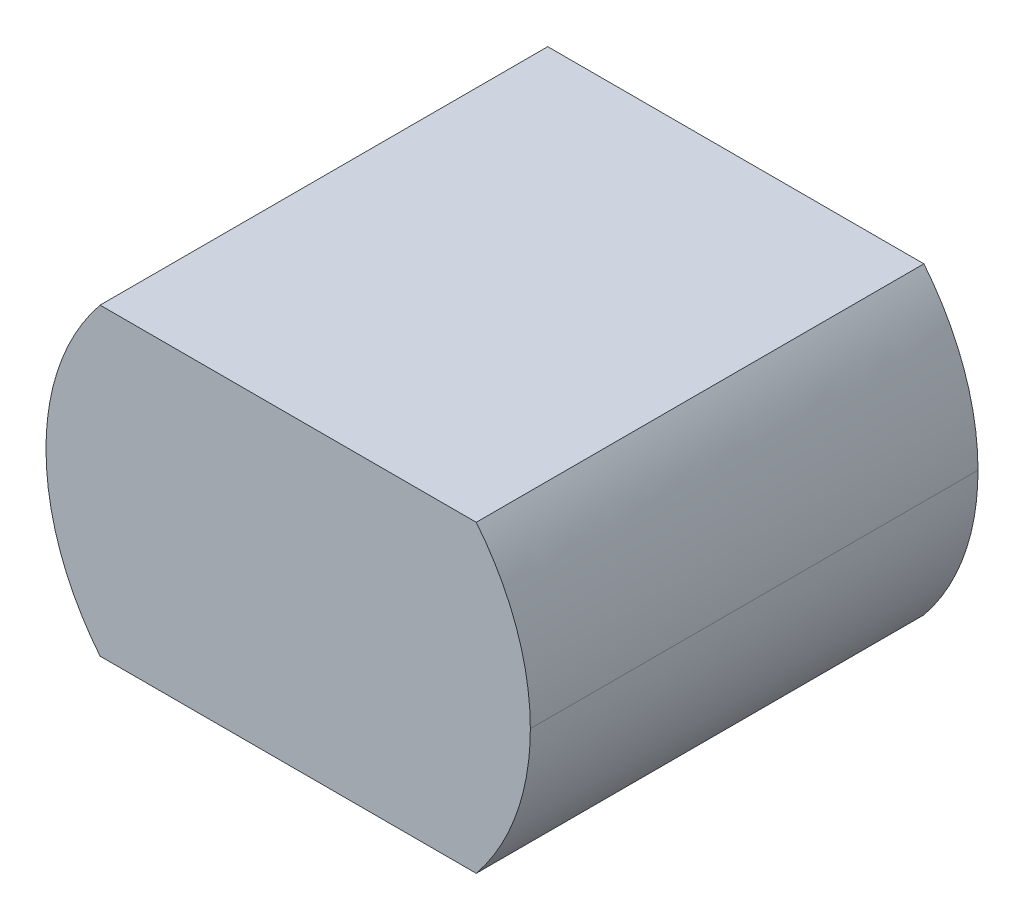
ISO-10303-21;
HEADER;
FILE_DESCRIPTION(('STEP AP214'),'2;1');
FILE_NAME('part.step','',(''),(''),'','','');
FILE_SCHEMA(('AUTOMOTIVE_DESIGN { 1 0 10303 214 1 1 1 1 }'));
ENDSEC;
DATA;
#1=APPLICATION_CONTEXT('core data for automotive mechanical design processes');
#2=APPLICATION_PROTOCOL_DEFINITION('international standard','automotive_design',2000,#1);
#3=PRODUCT_CONTEXT('',#1,'mechanical');
#4=PRODUCT('Part','Part','',(#3));
#5=PRODUCT_RELATED_PRODUCT_CATEGORY('part','',(#4));
#6=PRODUCT_DEFINITION_FORMATION('','',#4);
#7=PRODUCT_DEFINITION_CONTEXT('part definition',#1,'design');
#8=PRODUCT_DEFINITION('design','',#6,#7);
#9=PRODUCT_DEFINITION_SHAPE('','',#8);
#10=(LENGTH_UNIT() NAMED_UNIT(*) SI_UNIT(.MILLI.,.METRE.));
#11=(NAMED_UNIT(*) PLANE_ANGLE_UNIT() SI_UNIT($,.RADIAN.));
#12=(NAMED_UNIT(*) SI_UNIT($,.STERADIAN.) SOLID_ANGLE_UNIT());
#13=UNCERTAINTY_MEASURE_WITH_UNIT(LENGTH_MEASURE(1.E-05),#10,'distance_accuracy_value','');
#14=(GEOMETRIC_REPRESENTATION_CONTEXT(3) GLOBAL_UNCERTAINTY_ASSIGNED_CONTEXT((#13)) GLOBAL_UNIT_ASSIGNED_CONTEXT((#10,
#11,#12)) REPRESENTATION_CONTEXT('',''));
#15=CARTESIAN_POINT('',(0.,0.,0.));
#16=DIRECTION('',(0.,0.,1.));
#17=DIRECTION('',(1.,0.,0.));
#18=AXIS2_PLACEMENT_3D('',#15,#16,#17);
#19=CARTESIAN_POINT('',(102.326282,222.803668,6.35));
#20=CARTESIAN_POINT('',(102.803966,223.393521,6.35));
#21=CARTESIAN_POINT('',(103.093574,224.146283,6.35));
#22=CARTESIAN_POINT('',(103.093574,224.964432,6.35));
#23=B_SPLINE_CURVE_WITH_KNOTS('',3,(#19,#20,#21,#22),.UNSPECIFIED.,.F.,.F.,(4,4),(0.,1.),.UNSPECIFIED.);
#24=DIRECTION('',(0.,0.,-1.));
#25=VECTOR('',#24,1.);
#26=SURFACE_OF_LINEAR_EXTRUSION('',#23,#25);
#27=CARTESIAN_POINT('',(102.326282,222.803668,0.));
#28=CARTESIAN_POINT('',(102.803966,223.393521,0.));
#29=CARTESIAN_POINT('',(103.093574,224.146283,0.));
#30=CARTESIAN_POINT('',(103.093574,224.964432,0.));
#31=B_SPLINE_CURVE_WITH_KNOTS('',3,(#27,#28,#29,#30),.UNSPECIFIED.,.F.,.F.,(4,4),(0.,1.),.UNSPECIFIED.);
#32=CARTESIAN_POINT('',(102.326282,222.803668,0.));
#33=VERTEX_POINT('',#32);
#34=CARTESIAN_POINT('',(103.093574,224.964432,0.));
#35=VERTEX_POINT('',#34);
#36=EDGE_CURVE('E174',#33,#35,#31,.T.);
#37=ORIENTED_EDGE('',*,*,#36,.T.);
#38=DIRECTION('',(0.,0.,-1.));
#39=VECTOR('',#38,1.);
#40=CARTESIAN_POINT('',(103.093574,224.964432,6.35));
#41=LINE('',#40,#39);
#42=CARTESIAN_POINT('',(103.093574,224.964432,6.35));
#43=VERTEX_POINT('',#42);
#44=EDGE_CURVE('E11',#43,#35,#41,.T.);
#45=ORIENTED_EDGE('',*,*,#44,.F.);
#46=CARTESIAN_POINT('',(102.326282,222.803668,6.35));
#47=VERTEX_POINT('',#46);
#48=EDGE_CURVE('E146',#47,#43,#23,.T.);
#49=ORIENTED_EDGE('',*,*,#48,.F.);
#50=DIRECTION('',(0.,0.,-1.));
#51=VECTOR('',#50,1.);
#52=CARTESIAN_POINT('',(102.326282,222.803668,6.35));
#53=LINE('',#52,#51);
#54=EDGE_CURVE('E116',#47,#33,#53,.T.);
#55=ORIENTED_EDGE('',*,*,#54,.T.);
#56=EDGE_LOOP('',(#37,#45,#49,#55));
#57=FACE_BOUND('',#56,.T.);
#58=ADVANCED_FACE('F35',(#57),#26,.F.);
#59=CARTESIAN_POINT('',(103.093574,224.964432,6.35));
#60=CARTESIAN_POINT('',(103.093574,225.78258,6.35));
#61=CARTESIAN_POINT('',(102.803966,226.526523,6.35));
#62=CARTESIAN_POINT('',(102.326282,227.116376,6.35));
#63=B_SPLINE_CURVE_WITH_KNOTS('',3,(#59,#60,#61,#62),.UNSPECIFIED.,.F.,.F.,(4,4),(0.,1.),.UNSPECIFIED.);
#64=DIRECTION('',(0.,0.,-1.));
#65=VECTOR('',#64,1.);
#66=SURFACE_OF_LINEAR_EXTRUSION('',#63,#65);
#67=CARTESIAN_POINT('',(103.093574,224.964432,0.));
#68=CARTESIAN_POINT('',(103.093574,225.78258,0.));
#69=CARTESIAN_POINT('',(102.803966,226.526523,0.));
#70=CARTESIAN_POINT('',(102.326282,227.116376,0.));
#71=B_SPLINE_CURVE_WITH_KNOTS('',3,(#67,#68,#69,#70),.UNSPECIFIED.,.F.,.F.,(4,4),(0.,1.),.UNSPECIFIED.);
#72=CARTESIAN_POINT('',(102.326282,227.116376,0.));
#73=VERTEX_POINT('',#72);
#74=EDGE_CURVE('E172',#35,#73,#71,.T.);
#75=ORIENTED_EDGE('',*,*,#74,.T.);
#76=DIRECTION('',(0.,0.,-1.));
#77=VECTOR('',#76,1.);
#78=CARTESIAN_POINT('',(102.326282,227.116376,6.35));
#79=LINE('',#78,#77);
#80=CARTESIAN_POINT('',(102.326282,227.116376,6.35));
#81=VERTEX_POINT('',#80);
#82=EDGE_CURVE('E44',#81,#73,#79,.T.);
#83=ORIENTED_EDGE('',*,*,#82,.F.);
#84=EDGE_CURVE('E89',#43,#81,#63,.T.);
#85=ORIENTED_EDGE('',*,*,#84,.F.);
#86=ORIENTED_EDGE('',*,*,#44,.T.);
#87=EDGE_LOOP('',(#75,#83,#85,#86));
#88=FACE_BOUND('',#87,.T.);
#89=ADVANCED_FACE('F139',(#88),#66,.F.);
#90=CARTESIAN_POINT('',(0.,227.116376,6.35));
#91=DIRECTION('',(0.,-1.,0.));
#92=DIRECTION('',(0.,0.,-1.));
#93=AXIS2_PLACEMENT_3D('',#90,#91,#92);
#94=PLANE('',#93);
#95=DIRECTION('',(-1.,0.,0.));
#96=VECTOR('',#95,1.);
#97=CARTESIAN_POINT('',(0.,227.116376,0.));
#98=LINE('',#97,#96);
#99=CARTESIAN_POINT('',(96.990521,227.116376,0.));
#100=VERTEX_POINT('',#99);
#101=EDGE_CURVE('E168',#73,#100,#98,.T.);
#102=ORIENTED_EDGE('',*,*,#101,.T.);
#103=DIRECTION('',(0.,0.,-1.));
#104=VECTOR('',#103,1.);
#105=CARTESIAN_POINT('',(96.990521,227.116376,6.35));
#106=LINE('',#105,#104);
#107=CARTESIAN_POINT('',(96.990521,227.116376,6.35));
#108=VERTEX_POINT('',#107);
#109=EDGE_CURVE('E111',#108,#100,#106,.T.);
#110=ORIENTED_EDGE('',*,*,#109,.F.);
#111=DIRECTION('',(-1.,0.,0.));
#112=VECTOR('',#111,1.);
#113=CARTESIAN_POINT('',(0.,227.116376,6.35));
#114=LINE('',#113,#112);
#115=EDGE_CURVE('E102',#81,#108,#114,.T.);
#116=ORIENTED_EDGE('',*,*,#115,.F.);
#117=ORIENTED_EDGE('',*,*,#82,.T.);
#118=EDGE_LOOP('',(#102,#110,#116,#117));
#119=FACE_BOUND('',#118,.T.);
#120=ADVANCED_FACE('F137',(#119),#94,.F.);
#121=CARTESIAN_POINT('',(96.990521,227.116376,6.35));
#122=CARTESIAN_POINT('',(96.512837,226.526523,6.35));
#123=CARTESIAN_POINT('',(96.223229,225.78258,6.35));
#124=CARTESIAN_POINT('',(96.223229,224.964432,6.35));
#125=B_SPLINE_CURVE_WITH_KNOTS('',3,(#121,#122,#123,#124),.UNSPECIFIED.,.F.,.F.,(4,4),(0.,1.),.UNSPECIFIED.);
#126=DIRECTION('',(0.,0.,-1.));
#127=VECTOR('',#126,1.);
#128=SURFACE_OF_LINEAR_EXTRUSION('',#125,#127);
#129=CARTESIAN_POINT('',(96.990521,227.116376,0.));
#130=CARTESIAN_POINT('',(96.512837,226.526523,0.));
#131=CARTESIAN_POINT('',(96.223229,225.78258,0.));
#132=CARTESIAN_POINT('',(96.223229,224.964432,0.));
#133=B_SPLINE_CURVE_WITH_KNOTS('',3,(#129,#130,#131,#132),.UNSPECIFIED.,.F.,.F.,(4,4),(0.,1.),.UNSPECIFIED.);
#134=CARTESIAN_POINT('',(96.223229,224.964432,0.));
#135=VERTEX_POINT('',#134);
#136=EDGE_CURVE('E110',#100,#135,#133,.T.);
#137=ORIENTED_EDGE('',*,*,#136,.T.);
#138=DIRECTION('',(0.,0.,-1.));
#139=VECTOR('',#138,1.);
#140=CARTESIAN_POINT('',(96.223229,224.964432,6.35));
#141=LINE('',#140,#139);
#142=CARTESIAN_POINT('',(96.223229,224.964432,6.35));
#143=VERTEX_POINT('',#142);
#144=EDGE_CURVE('E107',#143,#135,#141,.T.);
#145=ORIENTED_EDGE('',*,*,#144,.F.);
#146=EDGE_CURVE('E96',#108,#143,#125,.T.);
#147=ORIENTED_EDGE('',*,*,#146,.F.);
#148=ORIENTED_EDGE('',*,*,#109,.T.);
#149=EDGE_LOOP('',(#137,#145,#147,#148));
#150=FACE_BOUND('',#149,.T.);
#151=ADVANCED_FACE('F108',(#150),#128,.F.);
#152=CARTESIAN_POINT('',(96.223229,224.964432,6.35));
#153=CARTESIAN_POINT('',(96.223229,224.146283,6.35));
#154=CARTESIAN_POINT('',(96.512837,223.393521,6.35));
#155=CARTESIAN_POINT('',(96.990521,222.803668,6.35));
#156=B_SPLINE_CURVE_WITH_KNOTS('',3,(#152,#153,#154,#155),.UNSPECIFIED.,.F.,.F.,(4,4),(0.,1.),.UNSPECIFIED.);
#157=DIRECTION('',(0.,0.,-1.));
#158=VECTOR('',#157,1.);
#159=SURFACE_OF_LINEAR_EXTRUSION('',#156,#158);
#160=CARTESIAN_POINT('',(96.223229,224.964432,0.));
#161=CARTESIAN_POINT('',(96.223229,224.146283,0.));
#162=CARTESIAN_POINT('',(96.512837,223.393521,0.));
#163=CARTESIAN_POINT('',(96.990521,222.803668,0.));
#164=B_SPLINE_CURVE_WITH_KNOTS('',3,(#160,#161,#162,#163),.UNSPECIFIED.,.F.,.F.,(4,4),(0.,1.),.UNSPECIFIED.);
#165=CARTESIAN_POINT('',(96.990521,222.803668,0.));
#166=VERTEX_POINT('',#165);
#167=EDGE_CURVE('E75',#135,#166,#164,.T.);
#168=ORIENTED_EDGE('',*,*,#167,.T.);
#169=DIRECTION('',(0.,0.,-1.));
#170=VECTOR('',#169,1.);
#171=CARTESIAN_POINT('',(96.990521,222.803668,6.35));
#172=LINE('',#171,#170);
#173=CARTESIAN_POINT('',(96.990521,222.803668,6.35));
#174=VERTEX_POINT('',#173);
#175=EDGE_CURVE('E112',#174,#166,#172,.T.);
#176=ORIENTED_EDGE('',*,*,#175,.F.);
#177=EDGE_CURVE('E100',#143,#174,#156,.T.);
#178=ORIENTED_EDGE('',*,*,#177,.F.);
#179=ORIENTED_EDGE('',*,*,#144,.T.);
#180=EDGE_LOOP('',(#168,#176,#178,#179));
#181=FACE_BOUND('',#180,.T.);
#182=ADVANCED_FACE('F114',(#181),#159,.F.);
#183=CARTESIAN_POINT('',(0.,222.803668,6.35));
#184=DIRECTION('',(0.,1.,0.));
#185=DIRECTION('',(0.,0.,1.));
#186=AXIS2_PLACEMENT_3D('',#183,#184,#185);
#187=PLANE('',#186);
#188=DIRECTION('',(1.,0.,0.));
#189=VECTOR('',#188,1.);
#190=CARTESIAN_POINT('',(0.,222.803668,0.));
#191=LINE('',#190,#189);
#192=EDGE_CURVE('E81',#166,#33,#191,.T.);
#193=ORIENTED_EDGE('',*,*,#192,.T.);
#194=ORIENTED_EDGE('',*,*,#54,.F.);
#195=DIRECTION('',(1.,0.,0.));
#196=VECTOR('',#195,1.);
#197=CARTESIAN_POINT('',(0.,222.803668,6.35));
#198=LINE('',#197,#196);
#199=EDGE_CURVE('E52',#174,#47,#198,.T.);
#200=ORIENTED_EDGE('',*,*,#199,.F.);
#201=ORIENTED_EDGE('',*,*,#175,.T.);
#202=EDGE_LOOP('',(#193,#194,#200,#201));
#203=FACE_BOUND('',#202,.T.);
#204=ADVANCED_FACE('F133',(#203),#187,.F.);
#205=CARTESIAN_POINT('',(0.,0.,6.35));
#206=DIRECTION('',(0.,0.,1.));
#207=DIRECTION('',(1.,0.,0.));
#208=AXIS2_PLACEMENT_3D('',#205,#206,#207);
#209=PLANE('',#208);
#210=ORIENTED_EDGE('',*,*,#48,.T.);
#211=ORIENTED_EDGE('',*,*,#84,.T.);
#212=ORIENTED_EDGE('',*,*,#115,.T.);
#213=ORIENTED_EDGE('',*,*,#146,.T.);
#214=ORIENTED_EDGE('',*,*,#177,.T.);
#215=ORIENTED_EDGE('',*,*,#199,.T.);
#216=EDGE_LOOP('',(#210,#211,#212,#213,#214,#215));
#217=FACE_BOUND('',#216,.T.);
#218=ADVANCED_FACE('F98',(#217),#209,.T.);
#219=CARTESIAN_POINT('',(0.,0.,0.));
#220=DIRECTION('',(0.,0.,1.));
#221=DIRECTION('',(1.,0.,0.));
#222=AXIS2_PLACEMENT_3D('',#219,#220,#221);
#223=PLANE('',#222);
#224=ORIENTED_EDGE('',*,*,#36,.F.);
#225=ORIENTED_EDGE('',*,*,#192,.F.);
#226=ORIENTED_EDGE('',*,*,#167,.F.);
#227=ORIENTED_EDGE('',*,*,#136,.F.);
#228=ORIENTED_EDGE('',*,*,#101,.F.);
#229=ORIENTED_EDGE('',*,*,#74,.F.);
#230=EDGE_LOOP('',(#224,#225,#226,#227,#228,#229));
#231=FACE_BOUND('',#230,.T.);
#232=ADVANCED_FACE('F171',(#231),#223,.F.);
#233=CLOSED_SHELL('',(#58,#89,#120,#151,#182,#204,#218,#232));
#234=MANIFOLD_SOLID_BREP('B2',#233);
#235=ADVANCED_BREP_SHAPE_REPRESENTATION('',(#18,#234),#14);
#236=SHAPE_DEFINITION_REPRESENTATION(#9,#235);
ENDSEC;
END-ISO-10303-21;
